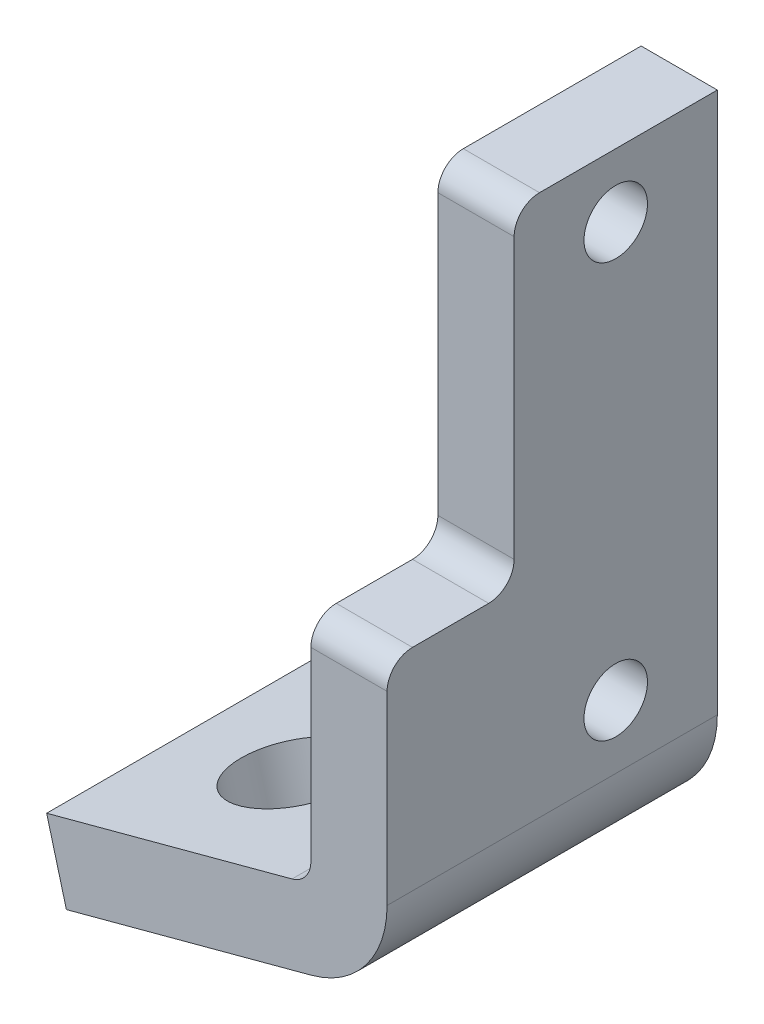
ISO-10303-21;
HEADER;
FILE_DESCRIPTION(('STEP AP214'),'2;1');
FILE_NAME('part.step','',(''),(''),'','','');
FILE_SCHEMA(('AUTOMOTIVE_DESIGN { 1 0 10303 214 1 1 1 1 }'));
ENDSEC;
DATA;
#1=APPLICATION_CONTEXT('core data for automotive mechanical design processes');
#2=APPLICATION_PROTOCOL_DEFINITION('international standard','automotive_design',2000,#1);
#3=PRODUCT_CONTEXT('',#1,'mechanical');
#4=PRODUCT('Part','Part','',(#3));
#5=PRODUCT_RELATED_PRODUCT_CATEGORY('part','',(#4));
#6=PRODUCT_DEFINITION_FORMATION('','',#4);
#7=PRODUCT_DEFINITION_CONTEXT('part definition',#1,'design');
#8=PRODUCT_DEFINITION('design','',#6,#7);
#9=PRODUCT_DEFINITION_SHAPE('','',#8);
#10=(LENGTH_UNIT() NAMED_UNIT(*) SI_UNIT(.MILLI.,.METRE.));
#11=(NAMED_UNIT(*) PLANE_ANGLE_UNIT() SI_UNIT($,.RADIAN.));
#12=(NAMED_UNIT(*) SI_UNIT($,.STERADIAN.) SOLID_ANGLE_UNIT());
#13=UNCERTAINTY_MEASURE_WITH_UNIT(LENGTH_MEASURE(1.E-05),#10,'distance_accuracy_value','');
#14=(GEOMETRIC_REPRESENTATION_CONTEXT(3) GLOBAL_UNCERTAINTY_ASSIGNED_CONTEXT((#13)) GLOBAL_UNIT_ASSIGNED_CONTEXT((#10,
#11,#12)) REPRESENTATION_CONTEXT('',''));
#15=CARTESIAN_POINT('',(0.,0.,0.));
#16=DIRECTION('',(0.,0.,1.));
#17=DIRECTION('',(1.,0.,0.));
#18=AXIS2_PLACEMENT_3D('',#15,#16,#17);
#19=CARTESIAN_POINT('',(-1.5,20.3,13.));
#20=DIRECTION('',(1.,0.,0.));
#21=DIRECTION('',(0.,1.,0.));
#22=AXIS2_PLACEMENT_3D('',#19,#20,#21);
#23=PLANE('',#22);
#24=CARTESIAN_POINT('',(-1.5,1.5,4.));
#25=DIRECTION('',(-1.,0.,0.));
#26=DIRECTION('',(0.,-1.,0.));
#27=AXIS2_PLACEMENT_3D('',#24,#25,#26);
#28=CIRCLE('',#27,1.25);
#29=CARTESIAN_POINT('',(-1.5,0.250000000000001,4.));
#30=VERTEX_POINT('',#29);
#31=EDGE_CURVE('E203',#30,#30,#28,.T.);
#32=ORIENTED_EDGE('',*,*,#31,.F.);
#33=EDGE_LOOP('',(#32));
#34=FACE_BOUND('',#33,.T.);
#35=CARTESIAN_POINT('',(-1.5,17.8,4.));
#36=DIRECTION('',(-1.,0.,0.));
#37=DIRECTION('',(0.,-1.,0.));
#38=AXIS2_PLACEMENT_3D('',#35,#36,#37);
#39=CIRCLE('',#38,1.25);
#40=CARTESIAN_POINT('',(-1.5,16.55,4.));
#41=VERTEX_POINT('',#40);
#42=EDGE_CURVE('E214',#41,#41,#39,.T.);
#43=ORIENTED_EDGE('',*,*,#42,.F.);
#44=EDGE_LOOP('',(#43));
#45=FACE_BOUND('',#44,.T.);
#46=DIRECTION('',(0.,-1.,0.));
#47=VECTOR('',#46,1.);
#48=CARTESIAN_POINT('',(-1.5,20.3,13.));
#49=LINE('',#48,#47);
#50=CARTESIAN_POINT('',(-1.5,6.3,13.));
#51=VERTEX_POINT('',#50);
#52=CARTESIAN_POINT('',(-1.5,-1.,13.));
#53=VERTEX_POINT('',#52);
#54=EDGE_CURVE('E130',#51,#53,#49,.T.);
#55=ORIENTED_EDGE('',*,*,#54,.F.);
#56=CARTESIAN_POINT('',(-1.5,6.3,12.));
#57=DIRECTION('',(1.,0.,0.));
#58=DIRECTION('',(0.,1.,0.));
#59=AXIS2_PLACEMENT_3D('',#56,#57,#58);
#60=CIRCLE('',#59,1.);
#61=CARTESIAN_POINT('',(-1.5,7.3,12.));
#62=VERTEX_POINT('',#61);
#63=EDGE_CURVE('E166',#51,#62,#60,.F.);
#64=ORIENTED_EDGE('',*,*,#63,.T.);
#65=DIRECTION('',(0.,0.,1.));
#66=VECTOR('',#65,1.);
#67=CARTESIAN_POINT('',(-1.5,7.3,8.));
#68=LINE('',#67,#66);
#69=CARTESIAN_POINT('',(-1.5,7.3,9.00000000000001));
#70=VERTEX_POINT('',#69);
#71=EDGE_CURVE('E185',#70,#62,#68,.T.);
#72=ORIENTED_EDGE('',*,*,#71,.F.);
#73=CARTESIAN_POINT('',(-1.5,8.3,9.00000000000001));
#74=DIRECTION('',(1.,0.,0.));
#75=DIRECTION('',(0.,1.,0.));
#76=AXIS2_PLACEMENT_3D('',#73,#74,#75);
#77=CIRCLE('',#76,1.);
#78=CARTESIAN_POINT('',(-1.5,8.30000000000001,8.));
#79=VERTEX_POINT('',#78);
#80=EDGE_CURVE('E41',#70,#79,#77,.T.);
#81=ORIENTED_EDGE('',*,*,#80,.T.);
#82=DIRECTION('',(0.,-1.,0.));
#83=VECTOR('',#82,1.);
#84=CARTESIAN_POINT('',(-1.5,20.3,8.));
#85=LINE('',#84,#83);
#86=CARTESIAN_POINT('',(-1.5,19.3,8.));
#87=VERTEX_POINT('',#86);
#88=EDGE_CURVE('E183',#87,#79,#85,.T.);
#89=ORIENTED_EDGE('',*,*,#88,.F.);
#90=CARTESIAN_POINT('',(-1.5,19.3,7.));
#91=DIRECTION('',(1.,0.,0.));
#92=DIRECTION('',(0.,1.,0.));
#93=AXIS2_PLACEMENT_3D('',#90,#91,#92);
#94=CIRCLE('',#93,1.);
#95=CARTESIAN_POINT('',(-1.5,20.3,7.));
#96=VERTEX_POINT('',#95);
#97=EDGE_CURVE('E155',#87,#96,#94,.F.);
#98=ORIENTED_EDGE('',*,*,#97,.T.);
#99=DIRECTION('',(0.,0.,-1.));
#100=VECTOR('',#99,1.);
#101=CARTESIAN_POINT('',(-1.5,20.3,13.));
#102=LINE('',#101,#100);
#103=CARTESIAN_POINT('',(-1.5,20.3,0.));
#104=VERTEX_POINT('',#103);
#105=EDGE_CURVE('E228',#96,#104,#102,.T.);
#106=ORIENTED_EDGE('',*,*,#105,.T.);
#107=DIRECTION('',(0.,-1.,0.));
#108=VECTOR('',#107,1.);
#109=CARTESIAN_POINT('',(-1.5,20.3,0.));
#110=LINE('',#109,#108);
#111=CARTESIAN_POINT('',(-1.5,-1.,0.));
#112=VERTEX_POINT('',#111);
#113=EDGE_CURVE('E153',#104,#112,#110,.T.);
#114=ORIENTED_EDGE('',*,*,#113,.T.);
#115=DIRECTION('',(0.,0.,-1.));
#116=VECTOR('',#115,1.);
#117=CARTESIAN_POINT('',(-1.5,-1.,13.));
#118=LINE('',#117,#116);
#119=EDGE_CURVE('E145',#53,#112,#118,.T.);
#120=ORIENTED_EDGE('',*,*,#119,.F.);
#121=EDGE_LOOP('',(#55,#64,#72,#81,#89,#98,#106,#114,#120));
#122=FACE_BOUND('',#121,.T.);
#123=ADVANCED_FACE('F33',(#34,#45,#122),#23,.F.);
#124=CARTESIAN_POINT('',(-2.5,-1.,13.));
#125=DIRECTION('',(0.,0.,-1.));
#126=DIRECTION('',(-1.,0.,0.));
#127=AXIS2_PLACEMENT_3D('',#124,#125,#126);
#128=CYLINDRICAL_SURFACE('',#127,1.);
#129=CARTESIAN_POINT('',(-2.5,-1.,0.));
#130=DIRECTION('',(0.,0.,-1.));
#131=DIRECTION('',(-1.,0.,0.));
#132=AXIS2_PLACEMENT_3D('',#129,#130,#131);
#133=CIRCLE('',#132,1.);
#134=CARTESIAN_POINT('',(-2.24118095489748,-1.96592582628907,0.));
#135=VERTEX_POINT('',#134);
#136=EDGE_CURVE('E230',#112,#135,#133,.T.);
#137=ORIENTED_EDGE('',*,*,#136,.T.);
#138=DIRECTION('',(0.,0.,-1.));
#139=VECTOR('',#138,1.);
#140=CARTESIAN_POINT('',(-2.24118095489748,-1.96592582628907,13.));
#141=LINE('',#140,#139);
#142=CARTESIAN_POINT('',(-2.24118095489748,-1.96592582628907,13.));
#143=VERTEX_POINT('',#142);
#144=EDGE_CURVE('E148',#143,#135,#141,.T.);
#145=ORIENTED_EDGE('',*,*,#144,.F.);
#146=CARTESIAN_POINT('',(-2.5,-1.,13.));
#147=DIRECTION('',(0.,0.,-1.));
#148=DIRECTION('',(-1.,0.,0.));
#149=AXIS2_PLACEMENT_3D('',#146,#147,#148);
#150=CIRCLE('',#149,1.);
#151=EDGE_CURVE('E134',#53,#143,#150,.T.);
#152=ORIENTED_EDGE('',*,*,#151,.F.);
#153=ORIENTED_EDGE('',*,*,#119,.T.);
#154=EDGE_LOOP('',(#137,#145,#152,#153));
#155=FACE_BOUND('',#154,.T.);
#156=ADVANCED_FACE('F144',(#155),#128,.F.);
#157=CARTESIAN_POINT('',(-2.24118095489748,-1.96592582628907,13.));
#158=DIRECTION('',(0.258819045102515,-0.96592582628907,0.));
#159=DIRECTION('',(0.96592582628907,0.258819045102515,0.));
#160=AXIS2_PLACEMENT_3D('',#157,#158,#159);
#161=PLANE('',#160);
#162=CARTESIAN_POINT('',(-7.07081008634283,-3.26002105180165,8.));
#163=DIRECTION('',(-0.258819045102515,0.96592582628907,0.));
#164=DIRECTION('',(-0.96592582628907,-0.258819045102515,0.));
#165=AXIS2_PLACEMENT_3D('',#162,#163,#164);
#166=CIRCLE('',#165,2.25);
#167=CARTESIAN_POINT('',(-9.24414319549324,-3.8423639032823,8.));
#168=VERTEX_POINT('',#167);
#169=EDGE_CURVE('E163',#168,#168,#166,.T.);
#170=ORIENTED_EDGE('',*,*,#169,.F.);
#171=EDGE_LOOP('',(#170));
#172=FACE_BOUND('',#171,.T.);
#173=DIRECTION('',(-0.96592582628907,-0.258819045102515,0.));
#174=VECTOR('',#173,1.);
#175=CARTESIAN_POINT('',(-2.24118095489748,-1.96592582628907,0.));
#176=LINE('',#175,#174);
#177=CARTESIAN_POINT('',(-11.9004392177882,-4.55411627731422,0.));
#178=VERTEX_POINT('',#177);
#179=EDGE_CURVE('E232',#135,#178,#176,.T.);
#180=ORIENTED_EDGE('',*,*,#179,.T.);
#181=DIRECTION('',(0.,0.,-1.));
#182=VECTOR('',#181,1.);
#183=CARTESIAN_POINT('',(-11.9004392177882,-4.55411627731422,13.));
#184=LINE('',#183,#182);
#185=CARTESIAN_POINT('',(-11.9004392177882,-4.55411627731422,13.));
#186=VERTEX_POINT('',#185);
#187=EDGE_CURVE('E157',#186,#178,#184,.T.);
#188=ORIENTED_EDGE('',*,*,#187,.F.);
#189=DIRECTION('',(-0.96592582628907,-0.258819045102515,0.));
#190=VECTOR('',#189,1.);
#191=CARTESIAN_POINT('',(-2.24118095489748,-1.96592582628907,13.));
#192=LINE('',#191,#190);
#193=EDGE_CURVE('E150',#143,#186,#192,.T.);
#194=ORIENTED_EDGE('',*,*,#193,.F.);
#195=ORIENTED_EDGE('',*,*,#144,.T.);
#196=EDGE_LOOP('',(#180,#188,#194,#195));
#197=FACE_BOUND('',#196,.T.);
#198=ADVANCED_FACE('F279',(#172,#197),#161,.F.);
#199=CARTESIAN_POINT('',(-11.9004392177882,-4.55411627731422,13.));
#200=DIRECTION('',(0.96592582628907,0.258819045102515,0.));
#201=DIRECTION('',(-0.258819045102515,0.96592582628907,0.));
#202=AXIS2_PLACEMENT_3D('',#199,#200,#201);
#203=PLANE('',#202);
#204=DIRECTION('',(0.258819045102515,-0.96592582628907,0.));
#205=VECTOR('',#204,1.);
#206=CARTESIAN_POINT('',(-11.9004392177882,-4.55411627731422,0.));
#207=LINE('',#206,#205);
#208=CARTESIAN_POINT('',(-11.1239820824806,-7.45189375618143,0.));
#209=VERTEX_POINT('',#208);
#210=EDGE_CURVE('E234',#178,#209,#207,.T.);
#211=ORIENTED_EDGE('',*,*,#210,.T.);
#212=DIRECTION('',(0.,0.,-1.));
#213=VECTOR('',#212,1.);
#214=CARTESIAN_POINT('',(-11.1239820824806,-7.45189375618143,13.));
#215=LINE('',#214,#213);
#216=CARTESIAN_POINT('',(-11.1239820824806,-7.45189375618143,13.));
#217=VERTEX_POINT('',#216);
#218=EDGE_CURVE('E254',#217,#209,#215,.T.);
#219=ORIENTED_EDGE('',*,*,#218,.F.);
#220=DIRECTION('',(0.258819045102515,-0.96592582628907,0.));
#221=VECTOR('',#220,1.);
#222=CARTESIAN_POINT('',(-11.9004392177882,-4.55411627731422,13.));
#223=LINE('',#222,#221);
#224=EDGE_CURVE('E220',#186,#217,#223,.T.);
#225=ORIENTED_EDGE('',*,*,#224,.F.);
#226=ORIENTED_EDGE('',*,*,#187,.T.);
#227=EDGE_LOOP('',(#211,#219,#225,#226));
#228=FACE_BOUND('',#227,.T.);
#229=ADVANCED_FACE('F261',(#228),#203,.F.);
#230=CARTESIAN_POINT('',(-11.1239820824806,-7.45189375618143,13.));
#231=DIRECTION('',(-0.258819045102515,0.96592582628907,0.));
#232=DIRECTION('',(-0.96592582628907,-0.258819045102515,0.));
#233=AXIS2_PLACEMENT_3D('',#230,#231,#232);
#234=PLANE('',#233);
#235=CARTESIAN_POINT('',(-6.29435295103529,-6.15779853066886,8.));
#236=DIRECTION('',(-0.258819045102515,0.96592582628907,0.));
#237=DIRECTION('',(-0.96592582628907,-0.258819045102515,0.));
#238=AXIS2_PLACEMENT_3D('',#235,#236,#237);
#239=CIRCLE('',#238,2.25);
#240=CARTESIAN_POINT('',(-8.4676860601857,-6.74014138214951,8.));
#241=VERTEX_POINT('',#240);
#242=EDGE_CURVE('E161',#241,#241,#239,.T.);
#243=ORIENTED_EDGE('',*,*,#242,.T.);
#244=EDGE_LOOP('',(#243));
#245=FACE_BOUND('',#244,.T.);
#246=DIRECTION('',(0.96592582628907,0.258819045102515,0.));
#247=VECTOR('',#246,1.);
#248=CARTESIAN_POINT('',(-11.1239820824806,-7.45189375618143,0.));
#249=LINE('',#248,#247);
#250=CARTESIAN_POINT('',(-1.46472381958994,-4.86370330515628,0.));
#251=VERTEX_POINT('',#250);
#252=EDGE_CURVE('E236',#209,#251,#249,.T.);
#253=ORIENTED_EDGE('',*,*,#252,.T.);
#254=DIRECTION('',(0.,0.,-1.));
#255=VECTOR('',#254,1.);
#256=CARTESIAN_POINT('',(-1.46472381958994,-4.86370330515628,13.));
#257=LINE('',#256,#255);
#258=CARTESIAN_POINT('',(-1.46472381958994,-4.86370330515628,13.));
#259=VERTEX_POINT('',#258);
#260=EDGE_CURVE('E251',#259,#251,#257,.T.);
#261=ORIENTED_EDGE('',*,*,#260,.F.);
#262=DIRECTION('',(0.96592582628907,0.258819045102515,0.));
#263=VECTOR('',#262,1.);
#264=CARTESIAN_POINT('',(-11.1239820824806,-7.45189375618143,13.));
#265=LINE('',#264,#263);
#266=EDGE_CURVE('E222',#217,#259,#265,.T.);
#267=ORIENTED_EDGE('',*,*,#266,.F.);
#268=ORIENTED_EDGE('',*,*,#218,.T.);
#269=EDGE_LOOP('',(#253,#261,#267,#268));
#270=FACE_BOUND('',#269,.T.);
#271=ADVANCED_FACE('F272',(#245,#270),#234,.F.);
#272=CARTESIAN_POINT('',(-2.5,-1.,13.));
#273=DIRECTION('',(0.,0.,-1.));
#274=DIRECTION('',(-1.,0.,0.));
#275=AXIS2_PLACEMENT_3D('',#272,#273,#274);
#276=CYLINDRICAL_SURFACE('',#275,4.);
#277=CARTESIAN_POINT('',(-2.5,-1.,0.));
#278=DIRECTION('',(0.,0.,1.));
#279=DIRECTION('',(-1.,0.,0.));
#280=AXIS2_PLACEMENT_3D('',#277,#278,#279);
#281=CIRCLE('',#280,4.);
#282=CARTESIAN_POINT('',(1.5,-1.,0.));
#283=VERTEX_POINT('',#282);
#284=EDGE_CURVE('E238',#251,#283,#281,.T.);
#285=ORIENTED_EDGE('',*,*,#284,.T.);
#286=DIRECTION('',(0.,0.,-1.));
#287=VECTOR('',#286,1.);
#288=CARTESIAN_POINT('',(1.5,-1.,13.));
#289=LINE('',#288,#287);
#290=CARTESIAN_POINT('',(1.5,-1.,13.));
#291=VERTEX_POINT('',#290);
#292=EDGE_CURVE('E248',#291,#283,#289,.T.);
#293=ORIENTED_EDGE('',*,*,#292,.F.);
#294=CARTESIAN_POINT('',(-2.5,-1.,13.));
#295=DIRECTION('',(0.,0.,1.));
#296=DIRECTION('',(-1.,0.,0.));
#297=AXIS2_PLACEMENT_3D('',#294,#295,#296);
#298=CIRCLE('',#297,4.);
#299=EDGE_CURVE('E224',#259,#291,#298,.T.);
#300=ORIENTED_EDGE('',*,*,#299,.F.);
#301=ORIENTED_EDGE('',*,*,#260,.T.);
#302=EDGE_LOOP('',(#285,#293,#300,#301));
#303=FACE_BOUND('',#302,.T.);
#304=ADVANCED_FACE('F276',(#303),#276,.T.);
#305=CARTESIAN_POINT('',(1.5,20.3,13.));
#306=DIRECTION('',(-1.,0.,0.));
#307=DIRECTION('',(0.,-1.,0.));
#308=AXIS2_PLACEMENT_3D('',#305,#306,#307);
#309=PLANE('',#308);
#310=CARTESIAN_POINT('',(1.50000000000001,1.5,4.));
#311=DIRECTION('',(-1.,0.,0.));
#312=DIRECTION('',(0.,-1.,0.));
#313=AXIS2_PLACEMENT_3D('',#310,#311,#312);
#314=CIRCLE('',#313,1.25);
#315=CARTESIAN_POINT('',(1.50000000000001,0.250000000000001,4.));
#316=VERTEX_POINT('',#315);
#317=EDGE_CURVE('E206',#316,#316,#314,.T.);
#318=ORIENTED_EDGE('',*,*,#317,.T.);
#319=EDGE_LOOP('',(#318));
#320=FACE_BOUND('',#319,.T.);
#321=CARTESIAN_POINT('',(1.5,17.8,4.));
#322=DIRECTION('',(-1.,0.,0.));
#323=DIRECTION('',(0.,-1.,0.));
#324=AXIS2_PLACEMENT_3D('',#321,#322,#323);
#325=CIRCLE('',#324,1.25);
#326=CARTESIAN_POINT('',(1.5,16.55,4.));
#327=VERTEX_POINT('',#326);
#328=EDGE_CURVE('E211',#327,#327,#325,.T.);
#329=ORIENTED_EDGE('',*,*,#328,.T.);
#330=EDGE_LOOP('',(#329));
#331=FACE_BOUND('',#330,.T.);
#332=DIRECTION('',(0.,0.,1.));
#333=VECTOR('',#332,1.);
#334=CARTESIAN_POINT('',(1.5,7.3,8.));
#335=LINE('',#334,#333);
#336=CARTESIAN_POINT('',(1.5,7.3,9.00000000000001));
#337=VERTEX_POINT('',#336);
#338=CARTESIAN_POINT('',(1.5,7.3,12.));
#339=VERTEX_POINT('',#338);
#340=EDGE_CURVE('E197',#337,#339,#335,.T.);
#341=ORIENTED_EDGE('',*,*,#340,.T.);
#342=CARTESIAN_POINT('',(1.5,6.3,12.));
#343=DIRECTION('',(-1.,0.,0.));
#344=DIRECTION('',(0.,-1.,0.));
#345=AXIS2_PLACEMENT_3D('',#342,#343,#344);
#346=CIRCLE('',#345,1.);
#347=CARTESIAN_POINT('',(1.5,6.3,13.));
#348=VERTEX_POINT('',#347);
#349=EDGE_CURVE('E175',#339,#348,#346,.F.);
#350=ORIENTED_EDGE('',*,*,#349,.T.);
#351=DIRECTION('',(0.,1.,0.));
#352=VECTOR('',#351,1.);
#353=CARTESIAN_POINT('',(1.5,20.3,13.));
#354=LINE('',#353,#352);
#355=EDGE_CURVE('E226',#291,#348,#354,.T.);
#356=ORIENTED_EDGE('',*,*,#355,.F.);
#357=ORIENTED_EDGE('',*,*,#292,.T.);
#358=DIRECTION('',(0.,1.,0.));
#359=VECTOR('',#358,1.);
#360=CARTESIAN_POINT('',(1.5,20.3,0.));
#361=LINE('',#360,#359);
#362=CARTESIAN_POINT('',(1.5,20.3,0.));
#363=VERTEX_POINT('',#362);
#364=EDGE_CURVE('E240',#283,#363,#361,.T.);
#365=ORIENTED_EDGE('',*,*,#364,.T.);
#366=DIRECTION('',(0.,0.,-1.));
#367=VECTOR('',#366,1.);
#368=CARTESIAN_POINT('',(1.5,20.3,13.));
#369=LINE('',#368,#367);
#370=CARTESIAN_POINT('',(1.5,20.3,7.));
#371=VERTEX_POINT('',#370);
#372=EDGE_CURVE('E246',#371,#363,#369,.T.);
#373=ORIENTED_EDGE('',*,*,#372,.F.);
#374=CARTESIAN_POINT('',(1.5,19.3,7.));
#375=DIRECTION('',(-1.,0.,0.));
#376=DIRECTION('',(0.,-1.,0.));
#377=AXIS2_PLACEMENT_3D('',#374,#375,#376);
#378=CIRCLE('',#377,1.);
#379=CARTESIAN_POINT('',(1.5,19.3,8.));
#380=VERTEX_POINT('',#379);
#381=EDGE_CURVE('E173',#371,#380,#378,.F.);
#382=ORIENTED_EDGE('',*,*,#381,.T.);
#383=DIRECTION('',(0.,-1.,0.));
#384=VECTOR('',#383,1.);
#385=CARTESIAN_POINT('',(1.5,20.3,8.));
#386=LINE('',#385,#384);
#387=CARTESIAN_POINT('',(1.5,8.30000000000001,8.));
#388=VERTEX_POINT('',#387);
#389=EDGE_CURVE('E199',#380,#388,#386,.T.);
#390=ORIENTED_EDGE('',*,*,#389,.T.);
#391=CARTESIAN_POINT('',(1.5,8.3,9.00000000000001));
#392=DIRECTION('',(-1.,0.,0.));
#393=DIRECTION('',(0.,-1.,0.));
#394=AXIS2_PLACEMENT_3D('',#391,#392,#393);
#395=CIRCLE('',#394,1.);
#396=EDGE_CURVE('E11',#388,#337,#395,.T.);
#397=ORIENTED_EDGE('',*,*,#396,.T.);
#398=EDGE_LOOP('',(#341,#350,#356,#357,#365,#373,#382,#390,#397));
#399=FACE_BOUND('',#398,.T.);
#400=ADVANCED_FACE('F196',(#320,#331,#399),#309,.F.);
#401=CARTESIAN_POINT('',(-1.5,20.3,13.));
#402=DIRECTION('',(0.,-1.,0.));
#403=DIRECTION('',(0.,0.,-1.));
#404=AXIS2_PLACEMENT_3D('',#401,#402,#403);
#405=PLANE('',#404);
#406=ORIENTED_EDGE('',*,*,#105,.F.);
#407=DIRECTION('',(-1.,0.,0.));
#408=VECTOR('',#407,1.);
#409=CARTESIAN_POINT('',(-1.5,20.3,7.));
#410=LINE('',#409,#408);
#411=EDGE_CURVE('E48',#96,#371,#410,.F.);
#412=ORIENTED_EDGE('',*,*,#411,.T.);
#413=ORIENTED_EDGE('',*,*,#372,.T.);
#414=DIRECTION('',(-1.,0.,0.));
#415=VECTOR('',#414,1.);
#416=CARTESIAN_POINT('',(-1.5,20.3,0.));
#417=LINE('',#416,#415);
#418=EDGE_CURVE('E140',#363,#104,#417,.T.);
#419=ORIENTED_EDGE('',*,*,#418,.T.);
#420=EDGE_LOOP('',(#406,#412,#413,#419));
#421=FACE_BOUND('',#420,.T.);
#422=ADVANCED_FACE('F311',(#421),#405,.F.);
#423=CARTESIAN_POINT('',(-2.5,-1.,13.));
#424=DIRECTION('',(0.,0.,-1.));
#425=DIRECTION('',(-1.,0.,0.));
#426=AXIS2_PLACEMENT_3D('',#423,#424,#425);
#427=PLANE('',#426);
#428=ORIENTED_EDGE('',*,*,#355,.T.);
#429=DIRECTION('',(-1.,0.,0.));
#430=VECTOR('',#429,1.);
#431=CARTESIAN_POINT('',(-2.5,6.3,13.));
#432=LINE('',#431,#430);
#433=EDGE_CURVE('E137',#348,#51,#432,.T.);
#434=ORIENTED_EDGE('',*,*,#433,.T.);
#435=ORIENTED_EDGE('',*,*,#54,.T.);
#436=ORIENTED_EDGE('',*,*,#151,.T.);
#437=ORIENTED_EDGE('',*,*,#193,.T.);
#438=ORIENTED_EDGE('',*,*,#224,.T.);
#439=ORIENTED_EDGE('',*,*,#266,.T.);
#440=ORIENTED_EDGE('',*,*,#299,.T.);
#441=EDGE_LOOP('',(#428,#434,#435,#436,#437,#438,#439,#440));
#442=FACE_BOUND('',#441,.T.);
#443=ADVANCED_FACE('F133',(#442),#427,.F.);
#444=CARTESIAN_POINT('',(-2.5,-1.,0.));
#445=DIRECTION('',(0.,0.,-1.));
#446=DIRECTION('',(-1.,0.,0.));
#447=AXIS2_PLACEMENT_3D('',#444,#445,#446);
#448=PLANE('',#447);
#449=ORIENTED_EDGE('',*,*,#113,.F.);
#450=ORIENTED_EDGE('',*,*,#418,.F.);
#451=ORIENTED_EDGE('',*,*,#364,.F.);
#452=ORIENTED_EDGE('',*,*,#284,.F.);
#453=ORIENTED_EDGE('',*,*,#252,.F.);
#454=ORIENTED_EDGE('',*,*,#210,.F.);
#455=ORIENTED_EDGE('',*,*,#179,.F.);
#456=ORIENTED_EDGE('',*,*,#136,.F.);
#457=EDGE_LOOP('',(#449,#450,#451,#452,#453,#454,#455,#456));
#458=FACE_BOUND('',#457,.T.);
#459=ADVANCED_FACE('F267',(#458),#448,.T.);
#460=CARTESIAN_POINT('',(-5.44870649996892,-9.31379405128895,8.));
#461=DIRECTION('',(-0.258819045102515,0.96592582628907,0.));
#462=DIRECTION('',(-0.96592582628907,-0.258819045102515,0.));
#463=AXIS2_PLACEMENT_3D('',#460,#461,#462);
#464=CYLINDRICAL_SURFACE('',#463,2.25);
#465=ORIENTED_EDGE('',*,*,#169,.T.);
#466=EDGE_LOOP('',(#465));
#467=FACE_BOUND('',#466,.T.);
#468=ORIENTED_EDGE('',*,*,#242,.F.);
#469=EDGE_LOOP('',(#468));
#470=FACE_BOUND('',#469,.T.);
#471=ADVANCED_FACE('F331',(#467,#470),#464,.F.);
#472=CARTESIAN_POINT('',(1.5,7.3,8.));
#473=DIRECTION('',(0.,-1.,0.));
#474=DIRECTION('',(1.,0.,0.));
#475=AXIS2_PLACEMENT_3D('',#472,#473,#474);
#476=PLANE('',#475);
#477=ORIENTED_EDGE('',*,*,#71,.T.);
#478=DIRECTION('',(-1.,0.,0.));
#479=VECTOR('',#478,1.);
#480=CARTESIAN_POINT('',(1.5,7.3,12.));
#481=LINE('',#480,#479);
#482=EDGE_CURVE('E171',#62,#339,#481,.F.);
#483=ORIENTED_EDGE('',*,*,#482,.T.);
#484=ORIENTED_EDGE('',*,*,#340,.F.);
#485=DIRECTION('',(-1.,0.,0.));
#486=VECTOR('',#485,1.);
#487=CARTESIAN_POINT('',(-1.5,7.3,9.00000000000001));
#488=LINE('',#487,#486);
#489=EDGE_CURVE('E168',#337,#70,#488,.T.);
#490=ORIENTED_EDGE('',*,*,#489,.T.);
#491=EDGE_LOOP('',(#477,#483,#484,#490));
#492=FACE_BOUND('',#491,.T.);
#493=ADVANCED_FACE('F201',(#492),#476,.F.);
#494=CARTESIAN_POINT('',(1.5,20.3,8.));
#495=DIRECTION('',(0.,0.,-1.));
#496=DIRECTION('',(0.,1.,0.));
#497=AXIS2_PLACEMENT_3D('',#494,#495,#496);
#498=PLANE('',#497);
#499=ORIENTED_EDGE('',*,*,#88,.T.);
#500=DIRECTION('',(-1.,0.,0.));
#501=VECTOR('',#500,1.);
#502=CARTESIAN_POINT('',(1.5,8.3,8.));
#503=LINE('',#502,#501);
#504=EDGE_CURVE('E56',#79,#388,#503,.F.);
#505=ORIENTED_EDGE('',*,*,#504,.T.);
#506=ORIENTED_EDGE('',*,*,#389,.F.);
#507=DIRECTION('',(-1.,0.,0.));
#508=VECTOR('',#507,1.);
#509=CARTESIAN_POINT('',(1.5,19.3,8.));
#510=LINE('',#509,#508);
#511=EDGE_CURVE('E177',#380,#87,#510,.T.);
#512=ORIENTED_EDGE('',*,*,#511,.T.);
#513=EDGE_LOOP('',(#499,#505,#506,#512));
#514=FACE_BOUND('',#513,.T.);
#515=ADVANCED_FACE('F188',(#514),#498,.F.);
#516=CARTESIAN_POINT('',(1.5,17.8,4.));
#517=DIRECTION('',(-1.,0.,0.));
#518=DIRECTION('',(0.,-1.,0.));
#519=AXIS2_PLACEMENT_3D('',#516,#517,#518);
#520=CYLINDRICAL_SURFACE('',#519,1.25);
#521=ORIENTED_EDGE('',*,*,#328,.F.);
#522=EDGE_LOOP('',(#521));
#523=FACE_BOUND('',#522,.T.);
#524=ORIENTED_EDGE('',*,*,#42,.T.);
#525=EDGE_LOOP('',(#524));
#526=FACE_BOUND('',#525,.T.);
#527=ADVANCED_FACE('F341',(#523,#526),#520,.F.);
#528=CARTESIAN_POINT('',(1.50000000000001,1.5,4.));
#529=DIRECTION('',(-1.,0.,0.));
#530=DIRECTION('',(0.,-1.,0.));
#531=AXIS2_PLACEMENT_3D('',#528,#529,#530);
#532=CYLINDRICAL_SURFACE('',#531,1.25);
#533=ORIENTED_EDGE('',*,*,#317,.F.);
#534=EDGE_LOOP('',(#533));
#535=FACE_BOUND('',#534,.T.);
#536=ORIENTED_EDGE('',*,*,#31,.T.);
#537=EDGE_LOOP('',(#536));
#538=FACE_BOUND('',#537,.T.);
#539=ADVANCED_FACE('F300',(#535,#538),#532,.F.);
#540=CARTESIAN_POINT('',(-2.5,6.3,12.));
#541=DIRECTION('',(-1.,0.,0.));
#542=DIRECTION('',(0.,-1.,0.));
#543=AXIS2_PLACEMENT_3D('',#540,#541,#542);
#544=CYLINDRICAL_SURFACE('',#543,1.);
#545=ORIENTED_EDGE('',*,*,#349,.F.);
#546=ORIENTED_EDGE('',*,*,#482,.F.);
#547=ORIENTED_EDGE('',*,*,#63,.F.);
#548=ORIENTED_EDGE('',*,*,#433,.F.);
#549=EDGE_LOOP('',(#545,#546,#547,#548));
#550=FACE_BOUND('',#549,.T.);
#551=ADVANCED_FACE('F298',(#550),#544,.T.);
#552=CARTESIAN_POINT('',(1.5,8.3,9.00000000000001));
#553=DIRECTION('',(1.,0.,0.));
#554=DIRECTION('',(0.,1.,0.));
#555=AXIS2_PLACEMENT_3D('',#552,#553,#554);
#556=CYLINDRICAL_SURFACE('',#555,1.);
#557=ORIENTED_EDGE('',*,*,#396,.F.);
#558=ORIENTED_EDGE('',*,*,#504,.F.);
#559=ORIENTED_EDGE('',*,*,#80,.F.);
#560=ORIENTED_EDGE('',*,*,#489,.F.);
#561=EDGE_LOOP('',(#557,#558,#559,#560));
#562=FACE_BOUND('',#561,.T.);
#563=ADVANCED_FACE('F192',(#562),#556,.F.);
#564=CARTESIAN_POINT('',(1.5,19.3,7.));
#565=DIRECTION('',(-1.,0.,0.));
#566=DIRECTION('',(0.,0.,1.));
#567=AXIS2_PLACEMENT_3D('',#564,#565,#566);
#568=CYLINDRICAL_SURFACE('',#567,1.);
#569=ORIENTED_EDGE('',*,*,#381,.F.);
#570=ORIENTED_EDGE('',*,*,#411,.F.);
#571=ORIENTED_EDGE('',*,*,#97,.F.);
#572=ORIENTED_EDGE('',*,*,#511,.F.);
#573=EDGE_LOOP('',(#569,#570,#571,#572));
#574=FACE_BOUND('',#573,.T.);
#575=ADVANCED_FACE('F35',(#574),#568,.T.);
#576=CLOSED_SHELL('',(#123,#156,#198,#229,#271,#304,#400,#422,#443,#459,#471,#493,#515,#527,
#539,#551,#563,#575));
#577=MANIFOLD_SOLID_BREP('B2',#576);
#578=ADVANCED_BREP_SHAPE_REPRESENTATION('',(#18,#577),#14);
#579=SHAPE_DEFINITION_REPRESENTATION(#9,#578);
ENDSEC;
END-ISO-10303-21;
